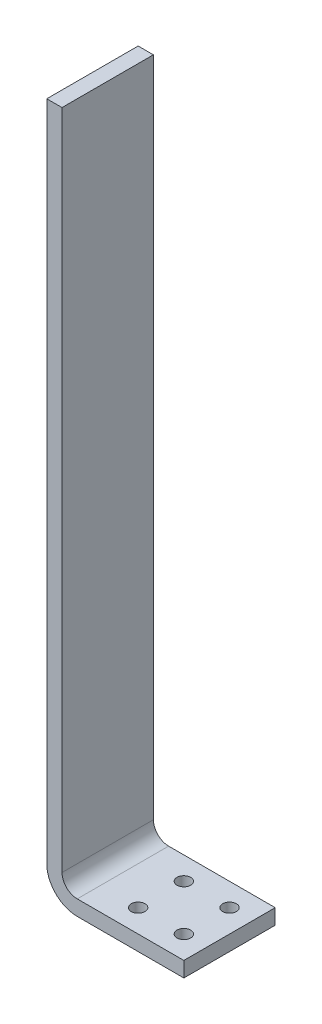
ISO-10303-21;
HEADER;
FILE_DESCRIPTION(('STEP AP214'),'2;1');
FILE_NAME('part.step','',(''),(''),'','','');
FILE_SCHEMA(('AUTOMOTIVE_DESIGN { 1 0 10303 214 1 1 1 1 }'));
ENDSEC;
DATA;
#1=APPLICATION_CONTEXT('core data for automotive mechanical design processes');
#2=APPLICATION_PROTOCOL_DEFINITION('international standard','automotive_design',2000,#1);
#3=PRODUCT_CONTEXT('',#1,'mechanical');
#4=PRODUCT('Part','Part','',(#3));
#5=PRODUCT_RELATED_PRODUCT_CATEGORY('part','',(#4));
#6=PRODUCT_DEFINITION_FORMATION('','',#4);
#7=PRODUCT_DEFINITION_CONTEXT('part definition',#1,'design');
#8=PRODUCT_DEFINITION('design','',#6,#7);
#9=PRODUCT_DEFINITION_SHAPE('','',#8);
#10=(LENGTH_UNIT() NAMED_UNIT(*) SI_UNIT(.MILLI.,.METRE.));
#11=(NAMED_UNIT(*) PLANE_ANGLE_UNIT() SI_UNIT($,.RADIAN.));
#12=(NAMED_UNIT(*) SI_UNIT($,.STERADIAN.) SOLID_ANGLE_UNIT());
#13=UNCERTAINTY_MEASURE_WITH_UNIT(LENGTH_MEASURE(1.E-05),#10,'distance_accuracy_value','');
#14=(GEOMETRIC_REPRESENTATION_CONTEXT(3) GLOBAL_UNCERTAINTY_ASSIGNED_CONTEXT((#13)) GLOBAL_UNIT_ASSIGNED_CONTEXT((#10,
#11,#12)) REPRESENTATION_CONTEXT('',''));
#15=CARTESIAN_POINT('',(0.,0.,0.));
#16=DIRECTION('',(0.,0.,1.));
#17=DIRECTION('',(1.,0.,0.));
#18=AXIS2_PLACEMENT_3D('',#15,#16,#17);
#19=CARTESIAN_POINT('',(10.,455.,60.));
#20=DIRECTION('',(0.,-1.,0.));
#21=DIRECTION('',(0.,0.,-1.));
#22=AXIS2_PLACEMENT_3D('',#19,#20,#21);
#23=PLANE('',#22);
#24=DIRECTION('',(-1.,0.,0.));
#25=VECTOR('',#24,1.);
#26=CARTESIAN_POINT('',(10.,455.,0.));
#27=LINE('',#26,#25);
#28=CARTESIAN_POINT('',(10.,455.,0.));
#29=VERTEX_POINT('',#28);
#30=CARTESIAN_POINT('',(0.,455.,0.));
#31=VERTEX_POINT('',#30);
#32=EDGE_CURVE('E135',#29,#31,#27,.T.);
#33=ORIENTED_EDGE('',*,*,#32,.T.);
#34=DIRECTION('',(0.,0.,-1.));
#35=VECTOR('',#34,1.);
#36=CARTESIAN_POINT('',(0.,455.,60.));
#37=LINE('',#36,#35);
#38=CARTESIAN_POINT('',(0.,455.,60.));
#39=VERTEX_POINT('',#38);
#40=EDGE_CURVE('E11',#39,#31,#37,.T.);
#41=ORIENTED_EDGE('',*,*,#40,.F.);
#42=DIRECTION('',(-1.,0.,0.));
#43=VECTOR('',#42,1.);
#44=CARTESIAN_POINT('',(10.,455.,60.));
#45=LINE('',#44,#43);
#46=CARTESIAN_POINT('',(10.,455.,60.));
#47=VERTEX_POINT('',#46);
#48=EDGE_CURVE('E150',#47,#39,#45,.T.);
#49=ORIENTED_EDGE('',*,*,#48,.F.);
#50=DIRECTION('',(0.,0.,-1.));
#51=VECTOR('',#50,1.);
#52=CARTESIAN_POINT('',(10.,455.,60.));
#53=LINE('',#52,#51);
#54=EDGE_CURVE('E131',#47,#29,#53,.T.);
#55=ORIENTED_EDGE('',*,*,#54,.T.);
#56=EDGE_LOOP('',(#33,#41,#49,#55));
#57=FACE_BOUND('',#56,.T.);
#58=ADVANCED_FACE('F39',(#57),#23,.F.);
#59=CARTESIAN_POINT('',(0.,20.,60.));
#60=DIRECTION('',(1.,0.,0.));
#61=DIRECTION('',(0.,0.,-1.));
#62=AXIS2_PLACEMENT_3D('',#59,#60,#61);
#63=PLANE('',#62);
#64=DIRECTION('',(0.,-1.,0.));
#65=VECTOR('',#64,1.);
#66=CARTESIAN_POINT('',(0.,20.,0.));
#67=LINE('',#66,#65);
#68=CARTESIAN_POINT('',(0.,20.,0.));
#69=VERTEX_POINT('',#68);
#70=EDGE_CURVE('E138',#31,#69,#67,.T.);
#71=ORIENTED_EDGE('',*,*,#70,.T.);
#72=DIRECTION('',(0.,0.,-1.));
#73=VECTOR('',#72,1.);
#74=CARTESIAN_POINT('',(0.,20.,60.));
#75=LINE('',#74,#73);
#76=CARTESIAN_POINT('',(0.,20.,60.));
#77=VERTEX_POINT('',#76);
#78=EDGE_CURVE('E47',#77,#69,#75,.T.);
#79=ORIENTED_EDGE('',*,*,#78,.F.);
#80=DIRECTION('',(0.,-1.,0.));
#81=VECTOR('',#80,1.);
#82=CARTESIAN_POINT('',(0.,20.,60.));
#83=LINE('',#82,#81);
#84=EDGE_CURVE('E98',#39,#77,#83,.T.);
#85=ORIENTED_EDGE('',*,*,#84,.F.);
#86=ORIENTED_EDGE('',*,*,#40,.T.);
#87=EDGE_LOOP('',(#71,#79,#85,#86));
#88=FACE_BOUND('',#87,.T.);
#89=ADVANCED_FACE('F231',(#88),#63,.F.);
#90=CARTESIAN_POINT('',(20.,20.,60.));
#91=DIRECTION('',(0.,0.,-1.));
#92=DIRECTION('',(-1.,0.,0.));
#93=AXIS2_PLACEMENT_3D('',#90,#91,#92);
#94=CYLINDRICAL_SURFACE('',#93,20.);
#95=CARTESIAN_POINT('',(20.,20.,0.));
#96=DIRECTION('',(0.,0.,1.));
#97=DIRECTION('',(1.,0.,0.));
#98=AXIS2_PLACEMENT_3D('',#95,#96,#97);
#99=CIRCLE('',#98,20.);
#100=CARTESIAN_POINT('',(20.,0.,0.));
#101=VERTEX_POINT('',#100);
#102=EDGE_CURVE('E141',#69,#101,#99,.T.);
#103=ORIENTED_EDGE('',*,*,#102,.T.);
#104=DIRECTION('',(0.,0.,-1.));
#105=VECTOR('',#104,1.);
#106=CARTESIAN_POINT('',(20.,0.,60.));
#107=LINE('',#106,#105);
#108=CARTESIAN_POINT('',(20.,0.,60.));
#109=VERTEX_POINT('',#108);
#110=EDGE_CURVE('E157',#109,#101,#107,.T.);
#111=ORIENTED_EDGE('',*,*,#110,.F.);
#112=CARTESIAN_POINT('',(20.,20.,60.));
#113=DIRECTION('',(0.,0.,1.));
#114=DIRECTION('',(1.,0.,0.));
#115=AXIS2_PLACEMENT_3D('',#112,#113,#114);
#116=CIRCLE('',#115,20.);
#117=EDGE_CURVE('E165',#77,#109,#116,.T.);
#118=ORIENTED_EDGE('',*,*,#117,.F.);
#119=ORIENTED_EDGE('',*,*,#78,.T.);
#120=EDGE_LOOP('',(#103,#111,#118,#119));
#121=FACE_BOUND('',#120,.T.);
#122=ADVANCED_FACE('F163',(#121),#94,.T.);
#123=CARTESIAN_POINT('',(20.,0.,60.));
#124=DIRECTION('',(0.,1.,0.));
#125=DIRECTION('',(0.,0.,1.));
#126=AXIS2_PLACEMENT_3D('',#123,#124,#125);
#127=PLANE('',#126);
#128=CARTESIAN_POINT('',(75.,0.,45.));
#129=DIRECTION('',(0.,1.,0.));
#130=DIRECTION('',(0.,0.,1.));
#131=AXIS2_PLACEMENT_3D('',#128,#129,#130);
#132=CIRCLE('',#131,4.50000000000001);
#133=CARTESIAN_POINT('',(75.,0.,49.5));
#134=VERTEX_POINT('',#133);
#135=EDGE_CURVE('E192',#134,#134,#132,.F.);
#136=ORIENTED_EDGE('',*,*,#135,.F.);
#137=EDGE_LOOP('',(#136));
#138=FACE_BOUND('',#137,.T.);
#139=CARTESIAN_POINT('',(45.,0.,15.));
#140=DIRECTION('',(0.,1.,0.));
#141=DIRECTION('',(0.,0.,1.));
#142=AXIS2_PLACEMENT_3D('',#139,#140,#141);
#143=CIRCLE('',#142,4.5);
#144=CARTESIAN_POINT('',(45.,0.,19.5));
#145=VERTEX_POINT('',#144);
#146=EDGE_CURVE('E193',#145,#145,#143,.F.);
#147=ORIENTED_EDGE('',*,*,#146,.F.);
#148=EDGE_LOOP('',(#147));
#149=FACE_BOUND('',#148,.T.);
#150=CARTESIAN_POINT('',(45.,0.,45.));
#151=DIRECTION('',(0.,1.,0.));
#152=DIRECTION('',(0.,0.,1.));
#153=AXIS2_PLACEMENT_3D('',#150,#151,#152);
#154=CIRCLE('',#153,4.5);
#155=CARTESIAN_POINT('',(45.,0.,49.5));
#156=VERTEX_POINT('',#155);
#157=EDGE_CURVE('E203',#156,#156,#154,.F.);
#158=ORIENTED_EDGE('',*,*,#157,.F.);
#159=EDGE_LOOP('',(#158));
#160=FACE_BOUND('',#159,.T.);
#161=CARTESIAN_POINT('',(75.,0.,15.));
#162=DIRECTION('',(0.,1.,0.));
#163=DIRECTION('',(0.,0.,1.));
#164=AXIS2_PLACEMENT_3D('',#161,#162,#163);
#165=CIRCLE('',#164,4.5);
#166=CARTESIAN_POINT('',(75.,0.,19.5));
#167=VERTEX_POINT('',#166);
#168=EDGE_CURVE('E139',#167,#167,#165,.F.);
#169=ORIENTED_EDGE('',*,*,#168,.F.);
#170=EDGE_LOOP('',(#169));
#171=FACE_BOUND('',#170,.T.);
#172=DIRECTION('',(1.,0.,0.));
#173=VECTOR('',#172,1.);
#174=CARTESIAN_POINT('',(20.,0.,0.));
#175=LINE('',#174,#173);
#176=CARTESIAN_POINT('',(90.,0.,0.));
#177=VERTEX_POINT('',#176);
#178=EDGE_CURVE('E143',#101,#177,#175,.T.);
#179=ORIENTED_EDGE('',*,*,#178,.T.);
#180=DIRECTION('',(0.,0.,-1.));
#181=VECTOR('',#180,1.);
#182=CARTESIAN_POINT('',(90.,0.,60.));
#183=LINE('',#182,#181);
#184=CARTESIAN_POINT('',(90.,0.,60.));
#185=VERTEX_POINT('',#184);
#186=EDGE_CURVE('E154',#185,#177,#183,.T.);
#187=ORIENTED_EDGE('',*,*,#186,.F.);
#188=DIRECTION('',(1.,0.,0.));
#189=VECTOR('',#188,1.);
#190=CARTESIAN_POINT('',(20.,0.,60.));
#191=LINE('',#190,#189);
#192=EDGE_CURVE('E177',#109,#185,#191,.T.);
#193=ORIENTED_EDGE('',*,*,#192,.F.);
#194=ORIENTED_EDGE('',*,*,#110,.T.);
#195=EDGE_LOOP('',(#179,#187,#193,#194));
#196=FACE_BOUND('',#195,.T.);
#197=ADVANCED_FACE('F173',(#138,#149,#160,#171,#196),#127,.F.);
#198=CARTESIAN_POINT('',(90.,10.,60.));
#199=DIRECTION('',(-1.,0.,0.));
#200=DIRECTION('',(0.,0.,1.));
#201=AXIS2_PLACEMENT_3D('',#198,#199,#200);
#202=PLANE('',#201);
#203=DIRECTION('',(0.,1.,0.));
#204=VECTOR('',#203,1.);
#205=CARTESIAN_POINT('',(90.,10.,0.));
#206=LINE('',#205,#204);
#207=CARTESIAN_POINT('',(90.,10.,0.));
#208=VERTEX_POINT('',#207);
#209=EDGE_CURVE('E145',#177,#208,#206,.T.);
#210=ORIENTED_EDGE('',*,*,#209,.T.);
#211=DIRECTION('',(0.,0.,-1.));
#212=VECTOR('',#211,1.);
#213=CARTESIAN_POINT('',(90.,10.,60.));
#214=LINE('',#213,#212);
#215=CARTESIAN_POINT('',(90.,10.,60.));
#216=VERTEX_POINT('',#215);
#217=EDGE_CURVE('E126',#216,#208,#214,.T.);
#218=ORIENTED_EDGE('',*,*,#217,.F.);
#219=DIRECTION('',(0.,1.,0.));
#220=VECTOR('',#219,1.);
#221=CARTESIAN_POINT('',(90.,10.,60.));
#222=LINE('',#221,#220);
#223=EDGE_CURVE('E117',#185,#216,#222,.T.);
#224=ORIENTED_EDGE('',*,*,#223,.F.);
#225=ORIENTED_EDGE('',*,*,#186,.T.);
#226=EDGE_LOOP('',(#210,#218,#224,#225));
#227=FACE_BOUND('',#226,.T.);
#228=ADVANCED_FACE('F176',(#227),#202,.F.);
#229=CARTESIAN_POINT('',(20.,10.,60.));
#230=DIRECTION('',(0.,-1.,0.));
#231=DIRECTION('',(0.,0.,-1.));
#232=AXIS2_PLACEMENT_3D('',#229,#230,#231);
#233=PLANE('',#232);
#234=CARTESIAN_POINT('',(75.,10.,45.));
#235=DIRECTION('',(0.,1.,0.));
#236=DIRECTION('',(0.,0.,1.));
#237=AXIS2_PLACEMENT_3D('',#234,#235,#236);
#238=CIRCLE('',#237,4.50000000000001);
#239=CARTESIAN_POINT('',(75.,10.,49.5));
#240=VERTEX_POINT('',#239);
#241=EDGE_CURVE('E188',#240,#240,#238,.T.);
#242=ORIENTED_EDGE('',*,*,#241,.F.);
#243=EDGE_LOOP('',(#242));
#244=FACE_BOUND('',#243,.T.);
#245=CARTESIAN_POINT('',(45.,10.,15.));
#246=DIRECTION('',(0.,1.,0.));
#247=DIRECTION('',(0.,0.,1.));
#248=AXIS2_PLACEMENT_3D('',#245,#246,#247);
#249=CIRCLE('',#248,4.5);
#250=CARTESIAN_POINT('',(45.,10.,19.5));
#251=VERTEX_POINT('',#250);
#252=EDGE_CURVE('E189',#251,#251,#249,.T.);
#253=ORIENTED_EDGE('',*,*,#252,.F.);
#254=EDGE_LOOP('',(#253));
#255=FACE_BOUND('',#254,.T.);
#256=CARTESIAN_POINT('',(45.,10.,45.));
#257=DIRECTION('',(0.,1.,0.));
#258=DIRECTION('',(0.,0.,1.));
#259=AXIS2_PLACEMENT_3D('',#256,#257,#258);
#260=CIRCLE('',#259,4.5);
#261=CARTESIAN_POINT('',(45.,10.,49.5));
#262=VERTEX_POINT('',#261);
#263=EDGE_CURVE('E196',#262,#262,#260,.T.);
#264=ORIENTED_EDGE('',*,*,#263,.F.);
#265=EDGE_LOOP('',(#264));
#266=FACE_BOUND('',#265,.T.);
#267=CARTESIAN_POINT('',(75.,10.,15.));
#268=DIRECTION('',(0.,1.,0.));
#269=DIRECTION('',(0.,0.,1.));
#270=AXIS2_PLACEMENT_3D('',#267,#268,#269);
#271=CIRCLE('',#270,4.5);
#272=CARTESIAN_POINT('',(75.,10.,19.5));
#273=VERTEX_POINT('',#272);
#274=EDGE_CURVE('E185',#273,#273,#271,.T.);
#275=ORIENTED_EDGE('',*,*,#274,.F.);
#276=EDGE_LOOP('',(#275));
#277=FACE_BOUND('',#276,.T.);
#278=DIRECTION('',(-1.,0.,0.));
#279=VECTOR('',#278,1.);
#280=CARTESIAN_POINT('',(20.,10.,0.));
#281=LINE('',#280,#279);
#282=CARTESIAN_POINT('',(20.,10.,0.));
#283=VERTEX_POINT('',#282);
#284=EDGE_CURVE('E125',#208,#283,#281,.T.);
#285=ORIENTED_EDGE('',*,*,#284,.T.);
#286=DIRECTION('',(0.,0.,-1.));
#287=VECTOR('',#286,1.);
#288=CARTESIAN_POINT('',(20.,10.,60.));
#289=LINE('',#288,#287);
#290=CARTESIAN_POINT('',(20.,10.,60.));
#291=VERTEX_POINT('',#290);
#292=EDGE_CURVE('E122',#291,#283,#289,.T.);
#293=ORIENTED_EDGE('',*,*,#292,.F.);
#294=DIRECTION('',(-1.,0.,0.));
#295=VECTOR('',#294,1.);
#296=CARTESIAN_POINT('',(20.,10.,60.));
#297=LINE('',#296,#295);
#298=EDGE_CURVE('E111',#216,#291,#297,.T.);
#299=ORIENTED_EDGE('',*,*,#298,.F.);
#300=ORIENTED_EDGE('',*,*,#217,.T.);
#301=EDGE_LOOP('',(#285,#293,#299,#300));
#302=FACE_BOUND('',#301,.T.);
#303=ADVANCED_FACE('F123',(#244,#255,#266,#277,#302),#233,.F.);
#304=CARTESIAN_POINT('',(20.,20.,60.));
#305=DIRECTION('',(0.,0.,-1.));
#306=DIRECTION('',(-1.,0.,0.));
#307=AXIS2_PLACEMENT_3D('',#304,#305,#306);
#308=CYLINDRICAL_SURFACE('',#307,10.);
#309=CARTESIAN_POINT('',(20.,20.,0.));
#310=DIRECTION('',(0.,0.,-1.));
#311=DIRECTION('',(1.,0.,0.));
#312=AXIS2_PLACEMENT_3D('',#309,#310,#311);
#313=CIRCLE('',#312,10.);
#314=CARTESIAN_POINT('',(10.,20.,0.));
#315=VERTEX_POINT('',#314);
#316=EDGE_CURVE('E84',#283,#315,#313,.T.);
#317=ORIENTED_EDGE('',*,*,#316,.T.);
#318=DIRECTION('',(0.,0.,-1.));
#319=VECTOR('',#318,1.);
#320=CARTESIAN_POINT('',(10.,20.,60.));
#321=LINE('',#320,#319);
#322=CARTESIAN_POINT('',(10.,20.,60.));
#323=VERTEX_POINT('',#322);
#324=EDGE_CURVE('E127',#323,#315,#321,.T.);
#325=ORIENTED_EDGE('',*,*,#324,.F.);
#326=CARTESIAN_POINT('',(20.,20.,60.));
#327=DIRECTION('',(0.,0.,-1.));
#328=DIRECTION('',(1.,0.,0.));
#329=AXIS2_PLACEMENT_3D('',#326,#327,#328);
#330=CIRCLE('',#329,10.);
#331=EDGE_CURVE('E115',#291,#323,#330,.T.);
#332=ORIENTED_EDGE('',*,*,#331,.F.);
#333=ORIENTED_EDGE('',*,*,#292,.T.);
#334=EDGE_LOOP('',(#317,#325,#332,#333));
#335=FACE_BOUND('',#334,.T.);
#336=ADVANCED_FACE('F129',(#335),#308,.F.);
#337=CARTESIAN_POINT('',(10.,20.,60.));
#338=DIRECTION('',(-1.,0.,0.));
#339=DIRECTION('',(0.,0.,1.));
#340=AXIS2_PLACEMENT_3D('',#337,#338,#339);
#341=PLANE('',#340);
#342=DIRECTION('',(0.,1.,0.));
#343=VECTOR('',#342,1.);
#344=CARTESIAN_POINT('',(10.,20.,0.));
#345=LINE('',#344,#343);
#346=EDGE_CURVE('E90',#315,#29,#345,.T.);
#347=ORIENTED_EDGE('',*,*,#346,.T.);
#348=ORIENTED_EDGE('',*,*,#54,.F.);
#349=DIRECTION('',(0.,1.,0.));
#350=VECTOR('',#349,1.);
#351=CARTESIAN_POINT('',(10.,20.,60.));
#352=LINE('',#351,#350);
#353=EDGE_CURVE('E55',#323,#47,#352,.T.);
#354=ORIENTED_EDGE('',*,*,#353,.F.);
#355=ORIENTED_EDGE('',*,*,#324,.T.);
#356=EDGE_LOOP('',(#347,#348,#354,#355));
#357=FACE_BOUND('',#356,.T.);
#358=ADVANCED_FACE('F238',(#357),#341,.F.);
#359=CARTESIAN_POINT('',(20.,20.,60.));
#360=DIRECTION('',(0.,0.,1.));
#361=DIRECTION('',(1.,0.,0.));
#362=AXIS2_PLACEMENT_3D('',#359,#360,#361);
#363=PLANE('',#362);
#364=ORIENTED_EDGE('',*,*,#48,.T.);
#365=ORIENTED_EDGE('',*,*,#84,.T.);
#366=ORIENTED_EDGE('',*,*,#117,.T.);
#367=ORIENTED_EDGE('',*,*,#192,.T.);
#368=ORIENTED_EDGE('',*,*,#223,.T.);
#369=ORIENTED_EDGE('',*,*,#298,.T.);
#370=ORIENTED_EDGE('',*,*,#331,.T.);
#371=ORIENTED_EDGE('',*,*,#353,.T.);
#372=EDGE_LOOP('',(#364,#365,#366,#367,#368,#369,#370,#371));
#373=FACE_BOUND('',#372,.T.);
#374=ADVANCED_FACE('F113',(#373),#363,.T.);
#375=CARTESIAN_POINT('',(20.,20.,0.));
#376=DIRECTION('',(0.,0.,1.));
#377=DIRECTION('',(1.,0.,0.));
#378=AXIS2_PLACEMENT_3D('',#375,#376,#377);
#379=PLANE('',#378);
#380=ORIENTED_EDGE('',*,*,#32,.F.);
#381=ORIENTED_EDGE('',*,*,#346,.F.);
#382=ORIENTED_EDGE('',*,*,#316,.F.);
#383=ORIENTED_EDGE('',*,*,#284,.F.);
#384=ORIENTED_EDGE('',*,*,#209,.F.);
#385=ORIENTED_EDGE('',*,*,#178,.F.);
#386=ORIENTED_EDGE('',*,*,#102,.F.);
#387=ORIENTED_EDGE('',*,*,#70,.F.);
#388=EDGE_LOOP('',(#380,#381,#382,#383,#384,#385,#386,#387));
#389=FACE_BOUND('',#388,.T.);
#390=ADVANCED_FACE('F169',(#389),#379,.F.);
#391=CARTESIAN_POINT('',(75.,-0.000999999999999265,15.));
#392=DIRECTION('',(0.,1.,0.));
#393=DIRECTION('',(0.,0.,1.));
#394=AXIS2_PLACEMENT_3D('',#391,#392,#393);
#395=CYLINDRICAL_SURFACE('',#394,4.5);
#396=ORIENTED_EDGE('',*,*,#274,.T.);
#397=EDGE_LOOP('',(#396));
#398=FACE_BOUND('',#397,.T.);
#399=ORIENTED_EDGE('',*,*,#168,.T.);
#400=EDGE_LOOP('',(#399));
#401=FACE_BOUND('',#400,.T.);
#402=ADVANCED_FACE('F215',(#398,#401),#395,.F.);
#403=CARTESIAN_POINT('',(45.,-0.000999999999999265,45.));
#404=DIRECTION('',(0.,1.,0.));
#405=DIRECTION('',(0.,0.,1.));
#406=AXIS2_PLACEMENT_3D('',#403,#404,#405);
#407=CYLINDRICAL_SURFACE('',#406,4.5);
#408=ORIENTED_EDGE('',*,*,#263,.T.);
#409=EDGE_LOOP('',(#408));
#410=FACE_BOUND('',#409,.T.);
#411=ORIENTED_EDGE('',*,*,#157,.T.);
#412=EDGE_LOOP('',(#411));
#413=FACE_BOUND('',#412,.T.);
#414=ADVANCED_FACE('F207',(#410,#413),#407,.F.);
#415=CARTESIAN_POINT('',(45.,-0.000999999999999265,15.));
#416=DIRECTION('',(0.,1.,0.));
#417=DIRECTION('',(0.,0.,1.));
#418=AXIS2_PLACEMENT_3D('',#415,#416,#417);
#419=CYLINDRICAL_SURFACE('',#418,4.5);
#420=ORIENTED_EDGE('',*,*,#252,.T.);
#421=EDGE_LOOP('',(#420));
#422=FACE_BOUND('',#421,.T.);
#423=ORIENTED_EDGE('',*,*,#146,.T.);
#424=EDGE_LOOP('',(#423));
#425=FACE_BOUND('',#424,.T.);
#426=ADVANCED_FACE('F223',(#422,#425),#419,.F.);
#427=CARTESIAN_POINT('',(75.,-0.000999999999999265,45.));
#428=DIRECTION('',(0.,1.,0.));
#429=DIRECTION('',(0.,0.,1.));
#430=AXIS2_PLACEMENT_3D('',#427,#428,#429);
#431=CYLINDRICAL_SURFACE('',#430,4.50000000000001);
#432=ORIENTED_EDGE('',*,*,#241,.T.);
#433=EDGE_LOOP('',(#432));
#434=FACE_BOUND('',#433,.T.);
#435=ORIENTED_EDGE('',*,*,#135,.T.);
#436=EDGE_LOOP('',(#435));
#437=FACE_BOUND('',#436,.T.);
#438=ADVANCED_FACE('F307',(#434,#437),#431,.F.);
#439=CLOSED_SHELL('',(#58,#89,#122,#197,#228,#303,#336,#358,#374,#390,#402,#414,#426,#438));
#440=MANIFOLD_SOLID_BREP('B2',#439);
#441=ADVANCED_BREP_SHAPE_REPRESENTATION('',(#18,#440),#14);
#442=SHAPE_DEFINITION_REPRESENTATION(#9,#441);
ENDSEC;
END-ISO-10303-21;
